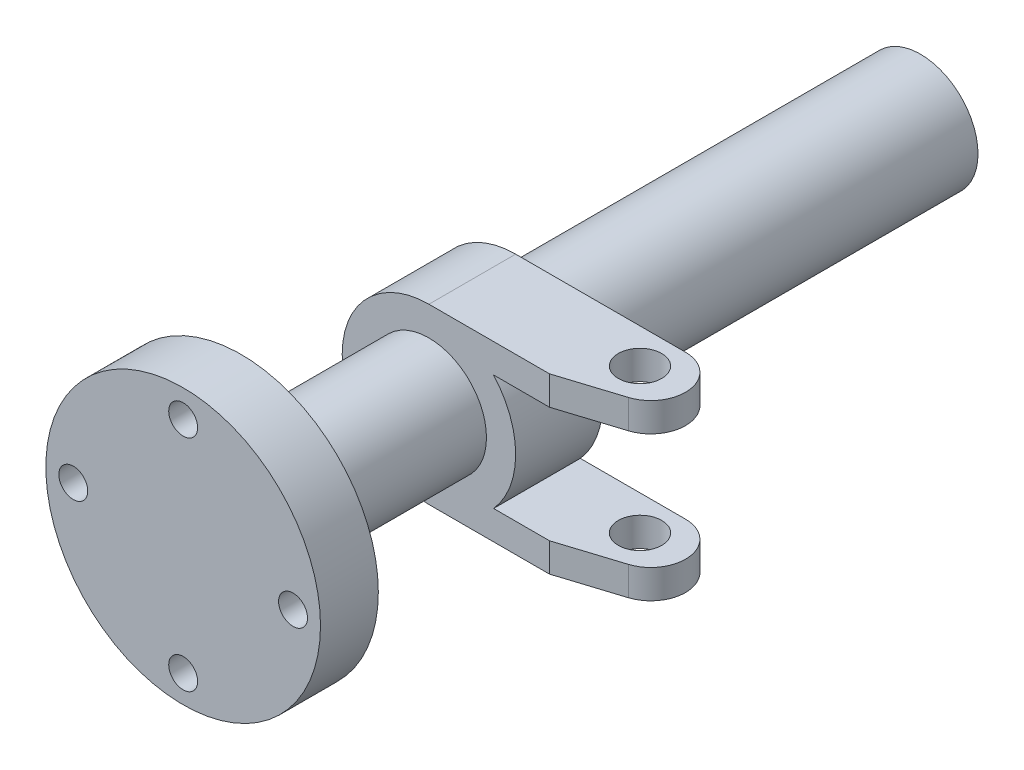
ISO-10303-21;
HEADER;
FILE_DESCRIPTION(('STEP AP214'),'2;1');
FILE_NAME('part.step','',(''),(''),'','','');
FILE_SCHEMA(('AUTOMOTIVE_DESIGN { 1 0 10303 214 1 1 1 1 }'));
ENDSEC;
DATA;
#1=APPLICATION_CONTEXT('core data for automotive mechanical design processes');
#2=APPLICATION_PROTOCOL_DEFINITION('international standard','automotive_design',2000,#1);
#3=PRODUCT_CONTEXT('',#1,'mechanical');
#4=PRODUCT('Part','Part','',(#3));
#5=PRODUCT_RELATED_PRODUCT_CATEGORY('part','',(#4));
#6=PRODUCT_DEFINITION_FORMATION('','',#4);
#7=PRODUCT_DEFINITION_CONTEXT('part definition',#1,'design');
#8=PRODUCT_DEFINITION('design','',#6,#7);
#9=PRODUCT_DEFINITION_SHAPE('','',#8);
#10=(LENGTH_UNIT() NAMED_UNIT(*) SI_UNIT(.MILLI.,.METRE.));
#11=(NAMED_UNIT(*) PLANE_ANGLE_UNIT() SI_UNIT($,.RADIAN.));
#12=(NAMED_UNIT(*) SI_UNIT($,.STERADIAN.) SOLID_ANGLE_UNIT());
#13=UNCERTAINTY_MEASURE_WITH_UNIT(LENGTH_MEASURE(1.E-05),#10,'distance_accuracy_value','');
#14=(GEOMETRIC_REPRESENTATION_CONTEXT(3) GLOBAL_UNCERTAINTY_ASSIGNED_CONTEXT((#13)) GLOBAL_UNIT_ASSIGNED_CONTEXT((#10,
#11,#12)) REPRESENTATION_CONTEXT('',''));
#15=CARTESIAN_POINT('',(0.,0.,0.));
#16=DIRECTION('',(0.,0.,1.));
#17=DIRECTION('',(1.,0.,0.));
#18=AXIS2_PLACEMENT_3D('',#15,#16,#17);
#19=CARTESIAN_POINT('',(0.,0.,0.));
#20=DIRECTION('',(0.,0.,1.));
#21=DIRECTION('',(1.,0.,0.));
#22=AXIS2_PLACEMENT_3D('',#19,#20,#21);
#23=CYLINDRICAL_SURFACE('',#22,30.);
#24=CARTESIAN_POINT('',(0.,0.,-85.));
#25=DIRECTION('',(0.,0.,1.));
#26=DIRECTION('',(1.,0.,0.));
#27=AXIS2_PLACEMENT_3D('',#24,#25,#26);
#28=CIRCLE('',#27,30.);
#29=CARTESIAN_POINT('',(22.3606797749979,-20.,-85.));
#30=VERTEX_POINT('',#29);
#31=CARTESIAN_POINT('',(22.3606797749979,20.,-85.));
#32=VERTEX_POINT('',#31);
#33=EDGE_CURVE('E69',#30,#32,#28,.T.);
#34=ORIENTED_EDGE('',*,*,#33,.F.);
#35=DIRECTION('',(0.,0.,1.));
#36=VECTOR('',#35,1.);
#37=CARTESIAN_POINT('',(22.3606797749979,-20.,0.));
#38=LINE('',#37,#36);
#39=CARTESIAN_POINT('',(22.3606797749979,-20.,-115.));
#40=VERTEX_POINT('',#39);
#41=EDGE_CURVE('E182',#30,#40,#38,.F.);
#42=ORIENTED_EDGE('',*,*,#41,.T.);
#43=CARTESIAN_POINT('',(0.,0.,-115.));
#44=DIRECTION('',(0.,0.,1.));
#45=DIRECTION('',(1.,0.,0.));
#46=AXIS2_PLACEMENT_3D('',#43,#44,#45);
#47=CIRCLE('',#46,30.);
#48=CARTESIAN_POINT('',(22.3606797749979,20.,-115.));
#49=VERTEX_POINT('',#48);
#50=EDGE_CURVE('E152',#40,#49,#47,.T.);
#51=ORIENTED_EDGE('',*,*,#50,.T.);
#52=DIRECTION('',(0.,0.,1.));
#53=VECTOR('',#52,1.);
#54=CARTESIAN_POINT('',(22.3606797749979,20.,0.));
#55=LINE('',#54,#53);
#56=EDGE_CURVE('E231',#49,#32,#55,.T.);
#57=ORIENTED_EDGE('',*,*,#56,.T.);
#58=EDGE_LOOP('',(#34,#42,#51,#57));
#59=FACE_BOUND('',#58,.T.);
#60=ADVANCED_FACE('F45',(#59),#23,.T.);
#61=CARTESIAN_POINT('',(0.,30.,-115.));
#62=VERTEX_POINT('',#61);
#63=CARTESIAN_POINT('',(0.,-30.,-115.));
#64=VERTEX_POINT('',#63);
#65=EDGE_CURVE('E61',#62,#64,#47,.T.);
#66=ORIENTED_EDGE('',*,*,#65,.T.);
#67=DIRECTION('',(0.,0.,1.));
#68=VECTOR('',#67,1.);
#69=CARTESIAN_POINT('',(0.,-30.,-115.));
#70=LINE('',#69,#68);
#71=CARTESIAN_POINT('',(0.,-30.,-85.));
#72=VERTEX_POINT('',#71);
#73=EDGE_CURVE('E167',#64,#72,#70,.T.);
#74=ORIENTED_EDGE('',*,*,#73,.T.);
#75=CARTESIAN_POINT('',(0.,30.,-85.));
#76=VERTEX_POINT('',#75);
#77=EDGE_CURVE('E256',#76,#72,#28,.T.);
#78=ORIENTED_EDGE('',*,*,#77,.F.);
#79=DIRECTION('',(0.,0.,1.));
#80=VECTOR('',#79,1.);
#81=CARTESIAN_POINT('',(0.,30.,-115.));
#82=LINE('',#81,#80);
#83=EDGE_CURVE('E192',#62,#76,#82,.T.);
#84=ORIENTED_EDGE('',*,*,#83,.F.);
#85=EDGE_LOOP('',(#66,#74,#78,#84));
#86=FACE_BOUND('',#85,.T.);
#87=ADVANCED_FACE('F275',(#86),#23,.T.);
#88=CARTESIAN_POINT('',(0.,0.,-255.));
#89=DIRECTION('',(0.,0.,-1.));
#90=DIRECTION('',(-1.,0.,0.));
#91=AXIS2_PLACEMENT_3D('',#88,#89,#90);
#92=PLANE('',#91);
#93=CARTESIAN_POINT('',(0.,0.,-255.));
#94=DIRECTION('',(0.,0.,1.));
#95=DIRECTION('',(1.,0.,0.));
#96=AXIS2_PLACEMENT_3D('',#93,#94,#95);
#97=CIRCLE('',#96,19.9);
#98=CARTESIAN_POINT('',(19.9,0.,-255.));
#99=VERTEX_POINT('',#98);
#100=EDGE_CURVE('E11',#99,#99,#97,.T.);
#101=ORIENTED_EDGE('',*,*,#100,.F.);
#102=EDGE_LOOP('',(#101));
#103=FACE_BOUND('',#102,.T.);
#104=ADVANCED_FACE('F47',(#103),#92,.T.);
#105=CARTESIAN_POINT('',(0.,0.,0.));
#106=DIRECTION('',(0.,0.,1.));
#107=DIRECTION('',(1.,0.,0.));
#108=AXIS2_PLACEMENT_3D('',#105,#106,#107);
#109=CYLINDRICAL_SURFACE('',#108,19.9);
#110=ORIENTED_EDGE('',*,*,#100,.T.);
#111=EDGE_LOOP('',(#110));
#112=FACE_BOUND('',#111,.T.);
#113=CARTESIAN_POINT('',(0.,0.,-115.));
#114=DIRECTION('',(0.,0.,1.));
#115=DIRECTION('',(1.,0.,0.));
#116=AXIS2_PLACEMENT_3D('',#113,#114,#115);
#117=CIRCLE('',#116,19.9);
#118=CARTESIAN_POINT('',(19.9,0.,-115.));
#119=VERTEX_POINT('',#118);
#120=EDGE_CURVE('E54',#119,#119,#117,.T.);
#121=ORIENTED_EDGE('',*,*,#120,.F.);
#122=EDGE_LOOP('',(#121));
#123=FACE_BOUND('',#122,.T.);
#124=ADVANCED_FACE('F265',(#112,#123),#109,.T.);
#125=CARTESIAN_POINT('',(19.9,0.,-115.));
#126=DIRECTION('',(0.,0.,-1.));
#127=DIRECTION('',(-1.,0.,0.));
#128=AXIS2_PLACEMENT_3D('',#125,#126,#127);
#129=PLANE('',#128);
#130=ORIENTED_EDGE('',*,*,#50,.F.);
#131=DIRECTION('',(-1.,0.,0.));
#132=VECTOR('',#131,1.);
#133=CARTESIAN_POINT('',(0.,-20.,-115.));
#134=LINE('',#133,#132);
#135=CARTESIAN_POINT('',(58.75,-20.,-115.));
#136=VERTEX_POINT('',#135);
#137=EDGE_CURVE('E130',#136,#40,#134,.T.);
#138=ORIENTED_EDGE('',*,*,#137,.F.);
#139=DIRECTION('',(0.,-1.,0.));
#140=VECTOR('',#139,1.);
#141=CARTESIAN_POINT('',(58.75,-20.,-115.));
#142=LINE('',#141,#140);
#143=CARTESIAN_POINT('',(58.75,-30.,-115.));
#144=VERTEX_POINT('',#143);
#145=EDGE_CURVE('E139',#136,#144,#142,.T.);
#146=ORIENTED_EDGE('',*,*,#145,.T.);
#147=DIRECTION('',(-1.,0.,0.));
#148=VECTOR('',#147,1.);
#149=CARTESIAN_POINT('',(0.,-30.,-115.));
#150=LINE('',#149,#148);
#151=EDGE_CURVE('E170',#144,#64,#150,.T.);
#152=ORIENTED_EDGE('',*,*,#151,.T.);
#153=ORIENTED_EDGE('',*,*,#65,.F.);
#154=DIRECTION('',(-1.,0.,0.));
#155=VECTOR('',#154,1.);
#156=CARTESIAN_POINT('',(0.,30.,-115.));
#157=LINE('',#156,#155);
#158=CARTESIAN_POINT('',(58.75,30.,-115.));
#159=VERTEX_POINT('',#158);
#160=EDGE_CURVE('E200',#159,#62,#157,.T.);
#161=ORIENTED_EDGE('',*,*,#160,.F.);
#162=DIRECTION('',(0.,1.,0.));
#163=VECTOR('',#162,1.);
#164=CARTESIAN_POINT('',(58.75,20.,-115.));
#165=LINE('',#164,#163);
#166=CARTESIAN_POINT('',(58.75,20.,-115.));
#167=VERTEX_POINT('',#166);
#168=EDGE_CURVE('E228',#167,#159,#165,.T.);
#169=ORIENTED_EDGE('',*,*,#168,.F.);
#170=DIRECTION('',(-1.,0.,0.));
#171=VECTOR('',#170,1.);
#172=CARTESIAN_POINT('',(0.,20.,-115.));
#173=LINE('',#172,#171);
#174=EDGE_CURVE('E207',#167,#49,#173,.T.);
#175=ORIENTED_EDGE('',*,*,#174,.T.);
#176=EDGE_LOOP('',(#130,#138,#146,#152,#153,#161,#169,#175));
#177=FACE_BOUND('',#176,.T.);
#178=ORIENTED_EDGE('',*,*,#120,.T.);
#179=EDGE_LOOP('',(#178));
#180=FACE_BOUND('',#179,.T.);
#181=ADVANCED_FACE('F149',(#177,#180),#129,.T.);
#182=CARTESIAN_POINT('',(30.,0.,-85.));
#183=DIRECTION('',(0.,0.,1.));
#184=DIRECTION('',(1.,0.,0.));
#185=AXIS2_PLACEMENT_3D('',#182,#183,#184);
#186=PLANE('',#185);
#187=ORIENTED_EDGE('',*,*,#77,.T.);
#188=DIRECTION('',(1.,0.,0.));
#189=VECTOR('',#188,1.);
#190=CARTESIAN_POINT('',(0.,-30.,-85.));
#191=LINE('',#190,#189);
#192=CARTESIAN_POINT('',(41.6842080505747,-30.,-85.));
#193=VERTEX_POINT('',#192);
#194=EDGE_CURVE('E154',#72,#193,#191,.T.);
#195=ORIENTED_EDGE('',*,*,#194,.T.);
#196=DIRECTION('',(0.,-1.,0.));
#197=VECTOR('',#196,1.);
#198=CARTESIAN_POINT('',(41.6842080505747,-20.,-85.));
#199=LINE('',#198,#197);
#200=CARTESIAN_POINT('',(41.6842080505747,-20.,-85.));
#201=VERTEX_POINT('',#200);
#202=EDGE_CURVE('E178',#201,#193,#199,.T.);
#203=ORIENTED_EDGE('',*,*,#202,.F.);
#204=DIRECTION('',(1.,0.,0.));
#205=VECTOR('',#204,1.);
#206=CARTESIAN_POINT('',(41.6842080505747,-20.,-85.));
#207=LINE('',#206,#205);
#208=EDGE_CURVE('E147',#30,#201,#207,.T.);
#209=ORIENTED_EDGE('',*,*,#208,.F.);
#210=ORIENTED_EDGE('',*,*,#33,.T.);
#211=DIRECTION('',(1.,0.,0.));
#212=VECTOR('',#211,1.);
#213=CARTESIAN_POINT('',(0.,20.,-85.));
#214=LINE('',#213,#212);
#215=CARTESIAN_POINT('',(41.6842080505747,20.,-85.));
#216=VERTEX_POINT('',#215);
#217=EDGE_CURVE('E196',#32,#216,#214,.T.);
#218=ORIENTED_EDGE('',*,*,#217,.T.);
#219=DIRECTION('',(0.,1.,0.));
#220=VECTOR('',#219,1.);
#221=CARTESIAN_POINT('',(41.6842080505747,20.,-85.));
#222=LINE('',#221,#220);
#223=CARTESIAN_POINT('',(41.6842080505747,30.,-85.));
#224=VERTEX_POINT('',#223);
#225=EDGE_CURVE('E210',#216,#224,#222,.T.);
#226=ORIENTED_EDGE('',*,*,#225,.T.);
#227=DIRECTION('',(1.,0.,0.));
#228=VECTOR('',#227,1.);
#229=CARTESIAN_POINT('',(41.6842080505747,30.,-85.));
#230=LINE('',#229,#228);
#231=EDGE_CURVE('E214',#76,#224,#230,.T.);
#232=ORIENTED_EDGE('',*,*,#231,.F.);
#233=EDGE_LOOP('',(#187,#195,#203,#209,#210,#218,#226,#232));
#234=FACE_BOUND('',#233,.T.);
#235=CARTESIAN_POINT('',(0.,0.,-85.));
#236=DIRECTION('',(0.,0.,1.));
#237=DIRECTION('',(1.,0.,0.));
#238=AXIS2_PLACEMENT_3D('',#235,#236,#237);
#239=CIRCLE('',#238,19.9);
#240=CARTESIAN_POINT('',(19.9,0.,-85.));
#241=VERTEX_POINT('',#240);
#242=EDGE_CURVE('E252',#241,#241,#239,.T.);
#243=ORIENTED_EDGE('',*,*,#242,.F.);
#244=EDGE_LOOP('',(#243));
#245=FACE_BOUND('',#244,.T.);
#246=ADVANCED_FACE('F273',(#234,#245),#186,.T.);
#247=CARTESIAN_POINT('',(0.,0.,0.));
#248=DIRECTION('',(0.,0.,1.));
#249=DIRECTION('',(1.,0.,0.));
#250=AXIS2_PLACEMENT_3D('',#247,#248,#249);
#251=CYLINDRICAL_SURFACE('',#250,19.9);
#252=ORIENTED_EDGE('',*,*,#242,.T.);
#253=EDGE_LOOP('',(#252));
#254=FACE_BOUND('',#253,.T.);
#255=CARTESIAN_POINT('',(0.,0.,-20.));
#256=DIRECTION('',(0.,0.,1.));
#257=DIRECTION('',(1.,0.,0.));
#258=AXIS2_PLACEMENT_3D('',#255,#256,#257);
#259=CIRCLE('',#258,19.9);
#260=CARTESIAN_POINT('',(19.9,0.,-20.));
#261=VERTEX_POINT('',#260);
#262=EDGE_CURVE('E248',#261,#261,#259,.T.);
#263=ORIENTED_EDGE('',*,*,#262,.F.);
#264=EDGE_LOOP('',(#263));
#265=FACE_BOUND('',#264,.T.);
#266=ADVANCED_FACE('F286',(#254,#265),#251,.T.);
#267=CARTESIAN_POINT('',(19.9,0.,-20.));
#268=DIRECTION('',(0.,0.,-1.));
#269=DIRECTION('',(-1.,0.,0.));
#270=AXIS2_PLACEMENT_3D('',#267,#268,#269);
#271=PLANE('',#270);
#272=CARTESIAN_POINT('',(38.,3.98028872628117E-13,-20.));
#273=DIRECTION('',(0.,0.,-1.));
#274=DIRECTION('',(-1.,0.,0.));
#275=AXIS2_PLACEMENT_3D('',#272,#273,#274);
#276=CIRCLE('',#275,7.);
#277=CARTESIAN_POINT('',(31.,3.98028872628117E-13,-20.));
#278=VERTEX_POINT('',#277);
#279=EDGE_CURVE('E392',#278,#278,#276,.T.);
#280=ORIENTED_EDGE('',*,*,#279,.F.);
#281=EDGE_LOOP('',(#280));
#282=FACE_BOUND('',#281,.T.);
#283=CARTESIAN_POINT('',(0.,-38.,-20.));
#284=DIRECTION('',(0.,0.,-1.));
#285=DIRECTION('',(-1.,0.,0.));
#286=AXIS2_PLACEMENT_3D('',#283,#284,#285);
#287=CIRCLE('',#286,7.);
#288=CARTESIAN_POINT('',(-7.,-38.,-20.));
#289=VERTEX_POINT('',#288);
#290=EDGE_CURVE('E406',#289,#289,#287,.T.);
#291=ORIENTED_EDGE('',*,*,#290,.F.);
#292=EDGE_LOOP('',(#291));
#293=FACE_BOUND('',#292,.T.);
#294=CARTESIAN_POINT('',(-38.,-1.32676290876039E-13,-20.));
#295=DIRECTION('',(0.,0.,-1.));
#296=DIRECTION('',(-1.,0.,0.));
#297=AXIS2_PLACEMENT_3D('',#294,#295,#296);
#298=CIRCLE('',#297,7.);
#299=CARTESIAN_POINT('',(-45.,-1.32676290876039E-13,-20.));
#300=VERTEX_POINT('',#299);
#301=EDGE_CURVE('E422',#300,#300,#298,.T.);
#302=ORIENTED_EDGE('',*,*,#301,.F.);
#303=EDGE_LOOP('',(#302));
#304=FACE_BOUND('',#303,.T.);
#305=CARTESIAN_POINT('',(0.,38.,-20.));
#306=DIRECTION('',(0.,0.,-1.));
#307=DIRECTION('',(-1.,0.,0.));
#308=AXIS2_PLACEMENT_3D('',#305,#306,#307);
#309=CIRCLE('',#308,7.);
#310=CARTESIAN_POINT('',(-7.,38.,-20.));
#311=VERTEX_POINT('',#310);
#312=EDGE_CURVE('E438',#311,#311,#309,.T.);
#313=ORIENTED_EDGE('',*,*,#312,.F.);
#314=EDGE_LOOP('',(#313));
#315=FACE_BOUND('',#314,.T.);
#316=ORIENTED_EDGE('',*,*,#262,.T.);
#317=EDGE_LOOP('',(#316));
#318=FACE_BOUND('',#317,.T.);
#319=CARTESIAN_POINT('',(0.,0.,-20.));
#320=DIRECTION('',(0.,0.,1.));
#321=DIRECTION('',(1.,0.,0.));
#322=AXIS2_PLACEMENT_3D('',#319,#320,#321);
#323=CIRCLE('',#322,47.5);
#324=CARTESIAN_POINT('',(47.5,0.,-20.));
#325=VERTEX_POINT('',#324);
#326=EDGE_CURVE('E244',#325,#325,#323,.T.);
#327=ORIENTED_EDGE('',*,*,#326,.F.);
#328=EDGE_LOOP('',(#327));
#329=FACE_BOUND('',#328,.T.);
#330=ADVANCED_FACE('F289',(#282,#293,#304,#315,#318,#329),#271,.T.);
#331=CARTESIAN_POINT('',(0.,0.,0.));
#332=DIRECTION('',(0.,0.,1.));
#333=DIRECTION('',(1.,0.,0.));
#334=AXIS2_PLACEMENT_3D('',#331,#332,#333);
#335=CYLINDRICAL_SURFACE('',#334,47.5);
#336=ORIENTED_EDGE('',*,*,#326,.T.);
#337=EDGE_LOOP('',(#336));
#338=FACE_BOUND('',#337,.T.);
#339=CARTESIAN_POINT('',(0.,0.,0.));
#340=DIRECTION('',(0.,0.,1.));
#341=DIRECTION('',(1.,0.,0.));
#342=AXIS2_PLACEMENT_3D('',#339,#340,#341);
#343=CIRCLE('',#342,47.5);
#344=CARTESIAN_POINT('',(47.5,0.,0.));
#345=VERTEX_POINT('',#344);
#346=EDGE_CURVE('E240',#345,#345,#343,.T.);
#347=ORIENTED_EDGE('',*,*,#346,.F.);
#348=EDGE_LOOP('',(#347));
#349=FACE_BOUND('',#348,.T.);
#350=ADVANCED_FACE('F293',(#338,#349),#335,.T.);
#351=CARTESIAN_POINT('',(47.5,0.,0.));
#352=DIRECTION('',(0.,0.,1.));
#353=DIRECTION('',(1.,0.,0.));
#354=AXIS2_PLACEMENT_3D('',#351,#352,#353);
#355=PLANE('',#354);
#356=CARTESIAN_POINT('',(38.,3.98028872628117E-13,0.));
#357=DIRECTION('',(0.,0.,-1.));
#358=DIRECTION('',(-1.,0.,0.));
#359=AXIS2_PLACEMENT_3D('',#356,#357,#358);
#360=CIRCLE('',#359,5.);
#361=CARTESIAN_POINT('',(33.,3.98028872628117E-13,0.));
#362=VERTEX_POINT('',#361);
#363=EDGE_CURVE('E402',#362,#362,#360,.T.);
#364=ORIENTED_EDGE('',*,*,#363,.T.);
#365=EDGE_LOOP('',(#364));
#366=FACE_BOUND('',#365,.T.);
#367=CARTESIAN_POINT('',(0.,-38.,0.));
#368=DIRECTION('',(0.,0.,-1.));
#369=DIRECTION('',(-1.,0.,0.));
#370=AXIS2_PLACEMENT_3D('',#367,#368,#369);
#371=CIRCLE('',#370,5.);
#372=CARTESIAN_POINT('',(-5.,-38.,0.));
#373=VERTEX_POINT('',#372);
#374=EDGE_CURVE('E418',#373,#373,#371,.T.);
#375=ORIENTED_EDGE('',*,*,#374,.T.);
#376=EDGE_LOOP('',(#375));
#377=FACE_BOUND('',#376,.T.);
#378=CARTESIAN_POINT('',(-38.,-1.32676290876039E-13,0.));
#379=DIRECTION('',(0.,0.,-1.));
#380=DIRECTION('',(-1.,0.,0.));
#381=AXIS2_PLACEMENT_3D('',#378,#379,#380);
#382=CIRCLE('',#381,5.);
#383=CARTESIAN_POINT('',(-43.,-1.32676290876039E-13,0.));
#384=VERTEX_POINT('',#383);
#385=EDGE_CURVE('E434',#384,#384,#382,.T.);
#386=ORIENTED_EDGE('',*,*,#385,.T.);
#387=EDGE_LOOP('',(#386));
#388=FACE_BOUND('',#387,.T.);
#389=CARTESIAN_POINT('',(0.,38.,0.));
#390=DIRECTION('',(0.,0.,-1.));
#391=DIRECTION('',(-1.,0.,0.));
#392=AXIS2_PLACEMENT_3D('',#389,#390,#391);
#393=CIRCLE('',#392,5.);
#394=CARTESIAN_POINT('',(-5.,38.,0.));
#395=VERTEX_POINT('',#394);
#396=EDGE_CURVE('E450',#395,#395,#393,.T.);
#397=ORIENTED_EDGE('',*,*,#396,.T.);
#398=EDGE_LOOP('',(#397));
#399=FACE_BOUND('',#398,.T.);
#400=ORIENTED_EDGE('',*,*,#346,.T.);
#401=EDGE_LOOP('',(#400));
#402=FACE_BOUND('',#401,.T.);
#403=ADVANCED_FACE('F297',(#366,#377,#388,#399,#402),#355,.T.);
#404=CARTESIAN_POINT('',(58.75,20.,-103.));
#405=DIRECTION('',(0.,1.,0.));
#406=DIRECTION('',(0.,0.,1.));
#407=AXIS2_PLACEMENT_3D('',#404,#405,#406);
#408=CYLINDRICAL_SURFACE('',#407,12.);
#409=CARTESIAN_POINT('',(58.75,30.,-103.));
#410=DIRECTION('',(0.,1.,0.));
#411=DIRECTION('',(0.,0.,1.));
#412=AXIS2_PLACEMENT_3D('',#409,#410,#411);
#413=CIRCLE('',#412,12.);
#414=CARTESIAN_POINT('',(62.3769898948419,30.,-91.5612525028867));
#415=VERTEX_POINT('',#414);
#416=EDGE_CURVE('E222',#415,#159,#413,.T.);
#417=ORIENTED_EDGE('',*,*,#416,.F.);
#418=DIRECTION('',(0.,1.,0.));
#419=VECTOR('',#418,1.);
#420=CARTESIAN_POINT('',(62.3769898948419,20.,-91.5612525028867));
#421=LINE('',#420,#419);
#422=CARTESIAN_POINT('',(62.3769898948419,20.,-91.5612525028867));
#423=VERTEX_POINT('',#422);
#424=EDGE_CURVE('E232',#423,#415,#421,.T.);
#425=ORIENTED_EDGE('',*,*,#424,.F.);
#426=CARTESIAN_POINT('',(58.75,20.,-103.));
#427=DIRECTION('',(0.,1.,0.));
#428=DIRECTION('',(0.,0.,1.));
#429=AXIS2_PLACEMENT_3D('',#426,#427,#428);
#430=CIRCLE('',#429,12.);
#431=EDGE_CURVE('E203',#423,#167,#430,.T.);
#432=ORIENTED_EDGE('',*,*,#431,.T.);
#433=ORIENTED_EDGE('',*,*,#168,.T.);
#434=EDGE_LOOP('',(#417,#425,#432,#433));
#435=FACE_BOUND('',#434,.T.);
#436=ADVANCED_FACE('F301',(#435),#408,.T.);
#437=CARTESIAN_POINT('',(60.,20.,-90.8075582430118));
#438=DIRECTION('',(0.302249157903488,0.,0.953228958092772));
#439=DIRECTION('',(0.953228958092772,0.,-0.302249157903488));
#440=AXIS2_PLACEMENT_3D('',#437,#438,#439);
#441=PLANE('',#440);
#442=DIRECTION('',(0.953228958092772,0.,-0.302249157903488));
#443=VECTOR('',#442,1.);
#444=CARTESIAN_POINT('',(60.,30.,-90.8075582430118));
#445=LINE('',#444,#443);
#446=EDGE_CURVE('E218',#224,#415,#445,.T.);
#447=ORIENTED_EDGE('',*,*,#446,.F.);
#448=ORIENTED_EDGE('',*,*,#225,.F.);
#449=DIRECTION('',(0.953228958092773,0.,-0.302249157903487));
#450=VECTOR('',#449,1.);
#451=CARTESIAN_POINT('',(60.,20.,-90.8075582430118));
#452=LINE('',#451,#450);
#453=EDGE_CURVE('E199',#216,#423,#452,.T.);
#454=ORIENTED_EDGE('',*,*,#453,.T.);
#455=ORIENTED_EDGE('',*,*,#424,.T.);
#456=EDGE_LOOP('',(#447,#448,#454,#455));
#457=FACE_BOUND('',#456,.T.);
#458=ADVANCED_FACE('F303',(#457),#441,.T.);
#459=CARTESIAN_POINT('',(58.75,20.,-103.));
#460=DIRECTION('',(0.,1.,0.));
#461=DIRECTION('',(0.,0.,1.));
#462=AXIS2_PLACEMENT_3D('',#459,#460,#461);
#463=PLANE('',#462);
#464=ORIENTED_EDGE('',*,*,#56,.F.);
#465=ORIENTED_EDGE('',*,*,#174,.F.);
#466=ORIENTED_EDGE('',*,*,#431,.F.);
#467=ORIENTED_EDGE('',*,*,#453,.F.);
#468=ORIENTED_EDGE('',*,*,#217,.F.);
#469=EDGE_LOOP('',(#464,#465,#466,#467,#468));
#470=FACE_BOUND('',#469,.T.);
#471=CARTESIAN_POINT('',(55.,20.,-103.));
#472=DIRECTION('',(0.,1.,0.));
#473=DIRECTION('',(0.,0.,1.));
#474=AXIS2_PLACEMENT_3D('',#471,#472,#473);
#475=CIRCLE('',#474,7.5);
#476=CARTESIAN_POINT('',(55.,20.,-95.5));
#477=VERTEX_POINT('',#476);
#478=EDGE_CURVE('E188',#477,#477,#475,.T.);
#479=ORIENTED_EDGE('',*,*,#478,.T.);
#480=EDGE_LOOP('',(#479));
#481=FACE_BOUND('',#480,.T.);
#482=ADVANCED_FACE('F306',(#470,#481),#463,.F.);
#483=CARTESIAN_POINT('',(58.75,30.,-103.));
#484=DIRECTION('',(0.,1.,0.));
#485=DIRECTION('',(0.,0.,1.));
#486=AXIS2_PLACEMENT_3D('',#483,#484,#485);
#487=PLANE('',#486);
#488=CARTESIAN_POINT('',(55.,30.,-103.));
#489=DIRECTION('',(0.,1.,0.));
#490=DIRECTION('',(0.,0.,1.));
#491=AXIS2_PLACEMENT_3D('',#488,#489,#490);
#492=CIRCLE('',#491,7.5);
#493=CARTESIAN_POINT('',(55.,30.,-95.5));
#494=VERTEX_POINT('',#493);
#495=EDGE_CURVE('E187',#494,#494,#492,.T.);
#496=ORIENTED_EDGE('',*,*,#495,.F.);
#497=EDGE_LOOP('',(#496));
#498=FACE_BOUND('',#497,.T.);
#499=ORIENTED_EDGE('',*,*,#83,.T.);
#500=ORIENTED_EDGE('',*,*,#231,.T.);
#501=ORIENTED_EDGE('',*,*,#446,.T.);
#502=ORIENTED_EDGE('',*,*,#416,.T.);
#503=ORIENTED_EDGE('',*,*,#160,.T.);
#504=EDGE_LOOP('',(#499,#500,#501,#502,#503));
#505=FACE_BOUND('',#504,.T.);
#506=ADVANCED_FACE('F311',(#498,#505),#487,.T.);
#507=CARTESIAN_POINT('',(55.,20.,-103.));
#508=DIRECTION('',(0.,1.,0.));
#509=DIRECTION('',(0.,0.,1.));
#510=AXIS2_PLACEMENT_3D('',#507,#508,#509);
#511=CYLINDRICAL_SURFACE('',#510,7.5);
#512=ORIENTED_EDGE('',*,*,#478,.F.);
#513=EDGE_LOOP('',(#512));
#514=FACE_BOUND('',#513,.T.);
#515=ORIENTED_EDGE('',*,*,#495,.T.);
#516=EDGE_LOOP('',(#515));
#517=FACE_BOUND('',#516,.T.);
#518=ADVANCED_FACE('F314',(#514,#517),#511,.F.);
#519=CARTESIAN_POINT('',(58.75,-20.,-103.));
#520=DIRECTION('',(0.,-1.,0.));
#521=DIRECTION('',(0.,0.,1.));
#522=AXIS2_PLACEMENT_3D('',#519,#520,#521);
#523=PLANE('',#522);
#524=ORIENTED_EDGE('',*,*,#41,.F.);
#525=ORIENTED_EDGE('',*,*,#208,.T.);
#526=DIRECTION('',(0.953228958092772,0.,-0.302249157903488));
#527=VECTOR('',#526,1.);
#528=CARTESIAN_POINT('',(60.,-20.,-90.8075582430118));
#529=LINE('',#528,#527);
#530=CARTESIAN_POINT('',(62.3769898948419,-20.,-91.5612525028867));
#531=VERTEX_POINT('',#530);
#532=EDGE_CURVE('E132',#201,#531,#529,.T.);
#533=ORIENTED_EDGE('',*,*,#532,.T.);
#534=CARTESIAN_POINT('',(58.75,-20.,-103.));
#535=DIRECTION('',(0.,1.,0.));
#536=DIRECTION('',(0.,0.,1.));
#537=AXIS2_PLACEMENT_3D('',#534,#535,#536);
#538=CIRCLE('',#537,12.);
#539=EDGE_CURVE('E125',#531,#136,#538,.T.);
#540=ORIENTED_EDGE('',*,*,#539,.T.);
#541=ORIENTED_EDGE('',*,*,#137,.T.);
#542=EDGE_LOOP('',(#524,#525,#533,#540,#541));
#543=FACE_BOUND('',#542,.T.);
#544=CARTESIAN_POINT('',(55.,-20.,-103.));
#545=DIRECTION('',(0.,1.,0.));
#546=DIRECTION('',(0.,0.,1.));
#547=AXIS2_PLACEMENT_3D('',#544,#545,#546);
#548=CIRCLE('',#547,7.5);
#549=CARTESIAN_POINT('',(55.,-20.,-95.5));
#550=VERTEX_POINT('',#549);
#551=EDGE_CURVE('E171',#550,#550,#548,.T.);
#552=ORIENTED_EDGE('',*,*,#551,.F.);
#553=EDGE_LOOP('',(#552));
#554=FACE_BOUND('',#553,.T.);
#555=ADVANCED_FACE('F127',(#543,#554),#523,.F.);
#556=CARTESIAN_POINT('',(58.75,-30.,-103.));
#557=DIRECTION('',(0.,-1.,0.));
#558=DIRECTION('',(0.,0.,1.));
#559=AXIS2_PLACEMENT_3D('',#556,#557,#558);
#560=PLANE('',#559);
#561=ORIENTED_EDGE('',*,*,#73,.F.);
#562=ORIENTED_EDGE('',*,*,#151,.F.);
#563=CARTESIAN_POINT('',(58.75,-30.,-103.));
#564=DIRECTION('',(0.,1.,0.));
#565=DIRECTION('',(0.,0.,1.));
#566=AXIS2_PLACEMENT_3D('',#563,#564,#565);
#567=CIRCLE('',#566,12.);
#568=CARTESIAN_POINT('',(62.3769898948419,-30.,-91.5612525028867));
#569=VERTEX_POINT('',#568);
#570=EDGE_CURVE('E142',#569,#144,#567,.T.);
#571=ORIENTED_EDGE('',*,*,#570,.F.);
#572=DIRECTION('',(0.953228958092773,0.,-0.302249157903487));
#573=VECTOR('',#572,1.);
#574=CARTESIAN_POINT('',(60.,-30.,-90.8075582430118));
#575=LINE('',#574,#573);
#576=EDGE_CURVE('E157',#193,#569,#575,.T.);
#577=ORIENTED_EDGE('',*,*,#576,.F.);
#578=ORIENTED_EDGE('',*,*,#194,.F.);
#579=EDGE_LOOP('',(#561,#562,#571,#577,#578));
#580=FACE_BOUND('',#579,.T.);
#581=CARTESIAN_POINT('',(55.,-30.,-103.));
#582=DIRECTION('',(0.,1.,0.));
#583=DIRECTION('',(0.,0.,1.));
#584=AXIS2_PLACEMENT_3D('',#581,#582,#583);
#585=CIRCLE('',#584,7.5);
#586=CARTESIAN_POINT('',(55.,-30.,-95.5));
#587=VERTEX_POINT('',#586);
#588=EDGE_CURVE('E160',#587,#587,#585,.T.);
#589=ORIENTED_EDGE('',*,*,#588,.T.);
#590=EDGE_LOOP('',(#589));
#591=FACE_BOUND('',#590,.T.);
#592=ADVANCED_FACE('F327',(#580,#591),#560,.T.);
#593=CARTESIAN_POINT('',(60.,-20.,-90.8075582430118));
#594=DIRECTION('',(-0.302249157903487,0.,-0.953228958092773));
#595=DIRECTION('',(-0.953228958092773,0.,0.302249157903487));
#596=AXIS2_PLACEMENT_3D('',#593,#594,#595);
#597=PLANE('',#596);
#598=ORIENTED_EDGE('',*,*,#576,.T.);
#599=DIRECTION('',(0.,-1.,0.));
#600=VECTOR('',#599,1.);
#601=CARTESIAN_POINT('',(62.3769898948419,-20.,-91.5612525028867));
#602=LINE('',#601,#600);
#603=EDGE_CURVE('E146',#531,#569,#602,.T.);
#604=ORIENTED_EDGE('',*,*,#603,.F.);
#605=ORIENTED_EDGE('',*,*,#532,.F.);
#606=ORIENTED_EDGE('',*,*,#202,.T.);
#607=EDGE_LOOP('',(#598,#604,#605,#606));
#608=FACE_BOUND('',#607,.T.);
#609=ADVANCED_FACE('F324',(#608),#597,.F.);
#610=CARTESIAN_POINT('',(58.75,-20.,-103.));
#611=DIRECTION('',(0.,-1.,0.));
#612=DIRECTION('',(0.,0.,-1.));
#613=AXIS2_PLACEMENT_3D('',#610,#611,#612);
#614=CYLINDRICAL_SURFACE('',#613,12.);
#615=ORIENTED_EDGE('',*,*,#570,.T.);
#616=ORIENTED_EDGE('',*,*,#145,.F.);
#617=ORIENTED_EDGE('',*,*,#539,.F.);
#618=ORIENTED_EDGE('',*,*,#603,.T.);
#619=EDGE_LOOP('',(#615,#616,#617,#618));
#620=FACE_BOUND('',#619,.T.);
#621=ADVANCED_FACE('F140',(#620),#614,.T.);
#622=CARTESIAN_POINT('',(55.,-20.,-103.));
#623=DIRECTION('',(0.,-1.,0.));
#624=DIRECTION('',(0.,0.,-1.));
#625=AXIS2_PLACEMENT_3D('',#622,#623,#624);
#626=CYLINDRICAL_SURFACE('',#625,7.5);
#627=ORIENTED_EDGE('',*,*,#551,.T.);
#628=EDGE_LOOP('',(#627));
#629=FACE_BOUND('',#628,.T.);
#630=ORIENTED_EDGE('',*,*,#588,.F.);
#631=EDGE_LOOP('',(#630));
#632=FACE_BOUND('',#631,.T.);
#633=ADVANCED_FACE('F323',(#629,#632),#626,.F.);
#634=CARTESIAN_POINT('',(0.,38.,-20.));
#635=DIRECTION('',(0.,0.,-1.));
#636=DIRECTION('',(-1.,0.,0.));
#637=AXIS2_PLACEMENT_3D('',#634,#635,#636);
#638=CYLINDRICAL_SURFACE('',#637,5.);
#639=ORIENTED_EDGE('',*,*,#396,.F.);
#640=EDGE_LOOP('',(#639));
#641=FACE_BOUND('',#640,.T.);
#642=CARTESIAN_POINT('',(0.,38.,-9.99999999999999));
#643=DIRECTION('',(0.,0.,-1.));
#644=DIRECTION('',(-1.,0.,0.));
#645=AXIS2_PLACEMENT_3D('',#642,#643,#644);
#646=CIRCLE('',#645,5.);
#647=CARTESIAN_POINT('',(-5.,38.,-9.99999999999999));
#648=VERTEX_POINT('',#647);
#649=EDGE_CURVE('E446',#648,#648,#646,.T.);
#650=ORIENTED_EDGE('',*,*,#649,.T.);
#651=EDGE_LOOP('',(#650));
#652=FACE_BOUND('',#651,.T.);
#653=ADVANCED_FACE('F336',(#641,#652),#638,.F.);
#654=CARTESIAN_POINT('',(5.,38.,-9.99999999999999));
#655=DIRECTION('',(0.,0.,1.));
#656=DIRECTION('',(1.,0.,0.));
#657=AXIS2_PLACEMENT_3D('',#654,#655,#656);
#658=PLANE('',#657);
#659=ORIENTED_EDGE('',*,*,#649,.F.);
#660=EDGE_LOOP('',(#659));
#661=FACE_BOUND('',#660,.T.);
#662=CARTESIAN_POINT('',(0.,38.,-9.99999999999999));
#663=DIRECTION('',(0.,0.,-1.));
#664=DIRECTION('',(-1.,0.,0.));
#665=AXIS2_PLACEMENT_3D('',#662,#663,#664);
#666=CIRCLE('',#665,7.);
#667=CARTESIAN_POINT('',(-7.,38.,-9.99999999999999));
#668=VERTEX_POINT('',#667);
#669=EDGE_CURVE('E442',#668,#668,#666,.T.);
#670=ORIENTED_EDGE('',*,*,#669,.T.);
#671=EDGE_LOOP('',(#670));
#672=FACE_BOUND('',#671,.T.);
#673=ADVANCED_FACE('F340',(#661,#672),#658,.F.);
#674=CARTESIAN_POINT('',(0.,38.,-20.));
#675=DIRECTION('',(0.,0.,-1.));
#676=DIRECTION('',(-1.,0.,0.));
#677=AXIS2_PLACEMENT_3D('',#674,#675,#676);
#678=CYLINDRICAL_SURFACE('',#677,7.);
#679=ORIENTED_EDGE('',*,*,#669,.F.);
#680=EDGE_LOOP('',(#679));
#681=FACE_BOUND('',#680,.T.);
#682=ORIENTED_EDGE('',*,*,#312,.T.);
#683=EDGE_LOOP('',(#682));
#684=FACE_BOUND('',#683,.T.);
#685=ADVANCED_FACE('F344',(#681,#684),#678,.F.);
#686=CARTESIAN_POINT('',(-38.,-1.32676290876039E-13,-20.));
#687=DIRECTION('',(0.,0.,-1.));
#688=DIRECTION('',(-1.,0.,0.));
#689=AXIS2_PLACEMENT_3D('',#686,#687,#688);
#690=CYLINDRICAL_SURFACE('',#689,5.);
#691=ORIENTED_EDGE('',*,*,#385,.F.);
#692=EDGE_LOOP('',(#691));
#693=FACE_BOUND('',#692,.T.);
#694=CARTESIAN_POINT('',(-38.,-1.32676290876039E-13,-9.99999999999999));
#695=DIRECTION('',(0.,0.,-1.));
#696=DIRECTION('',(-1.,0.,0.));
#697=AXIS2_PLACEMENT_3D('',#694,#695,#696);
#698=CIRCLE('',#697,5.);
#699=CARTESIAN_POINT('',(-43.,-1.32676290876039E-13,-9.99999999999999));
#700=VERTEX_POINT('',#699);
#701=EDGE_CURVE('E430',#700,#700,#698,.T.);
#702=ORIENTED_EDGE('',*,*,#701,.T.);
#703=EDGE_LOOP('',(#702));
#704=FACE_BOUND('',#703,.T.);
#705=ADVANCED_FACE('F348',(#693,#704),#690,.F.);
#706=CARTESIAN_POINT('',(-33.,-1.32676290876039E-13,-9.99999999999999));
#707=DIRECTION('',(0.,0.,1.));
#708=DIRECTION('',(1.,0.,0.));
#709=AXIS2_PLACEMENT_3D('',#706,#707,#708);
#710=PLANE('',#709);
#711=ORIENTED_EDGE('',*,*,#701,.F.);
#712=EDGE_LOOP('',(#711));
#713=FACE_BOUND('',#712,.T.);
#714=CARTESIAN_POINT('',(-38.,-1.32676290876039E-13,-9.99999999999999));
#715=DIRECTION('',(0.,0.,-1.));
#716=DIRECTION('',(-1.,0.,0.));
#717=AXIS2_PLACEMENT_3D('',#714,#715,#716);
#718=CIRCLE('',#717,7.);
#719=CARTESIAN_POINT('',(-45.,-1.32676290876039E-13,-9.99999999999999));
#720=VERTEX_POINT('',#719);
#721=EDGE_CURVE('E426',#720,#720,#718,.T.);
#722=ORIENTED_EDGE('',*,*,#721,.T.);
#723=EDGE_LOOP('',(#722));
#724=FACE_BOUND('',#723,.T.);
#725=ADVANCED_FACE('F352',(#713,#724),#710,.F.);
#726=CARTESIAN_POINT('',(-38.,-1.32676290876039E-13,-20.));
#727=DIRECTION('',(0.,0.,-1.));
#728=DIRECTION('',(-1.,0.,0.));
#729=AXIS2_PLACEMENT_3D('',#726,#727,#728);
#730=CYLINDRICAL_SURFACE('',#729,7.);
#731=ORIENTED_EDGE('',*,*,#721,.F.);
#732=EDGE_LOOP('',(#731));
#733=FACE_BOUND('',#732,.T.);
#734=ORIENTED_EDGE('',*,*,#301,.T.);
#735=EDGE_LOOP('',(#734));
#736=FACE_BOUND('',#735,.T.);
#737=ADVANCED_FACE('F356',(#733,#736),#730,.F.);
#738=CARTESIAN_POINT('',(0.,-38.,-20.));
#739=DIRECTION('',(0.,0.,-1.));
#740=DIRECTION('',(-1.,0.,0.));
#741=AXIS2_PLACEMENT_3D('',#738,#739,#740);
#742=CYLINDRICAL_SURFACE('',#741,5.);
#743=ORIENTED_EDGE('',*,*,#374,.F.);
#744=EDGE_LOOP('',(#743));
#745=FACE_BOUND('',#744,.T.);
#746=CARTESIAN_POINT('',(0.,-38.,-9.99999999999999));
#747=DIRECTION('',(0.,0.,-1.));
#748=DIRECTION('',(-1.,0.,0.));
#749=AXIS2_PLACEMENT_3D('',#746,#747,#748);
#750=CIRCLE('',#749,5.);
#751=CARTESIAN_POINT('',(-5.,-38.,-9.99999999999999));
#752=VERTEX_POINT('',#751);
#753=EDGE_CURVE('E414',#752,#752,#750,.T.);
#754=ORIENTED_EDGE('',*,*,#753,.T.);
#755=EDGE_LOOP('',(#754));
#756=FACE_BOUND('',#755,.T.);
#757=ADVANCED_FACE('F360',(#745,#756),#742,.F.);
#758=CARTESIAN_POINT('',(5.,-38.,-9.99999999999999));
#759=DIRECTION('',(0.,0.,1.));
#760=DIRECTION('',(1.,0.,0.));
#761=AXIS2_PLACEMENT_3D('',#758,#759,#760);
#762=PLANE('',#761);
#763=ORIENTED_EDGE('',*,*,#753,.F.);
#764=EDGE_LOOP('',(#763));
#765=FACE_BOUND('',#764,.T.);
#766=CARTESIAN_POINT('',(0.,-38.,-9.99999999999999));
#767=DIRECTION('',(0.,0.,-1.));
#768=DIRECTION('',(-1.,0.,0.));
#769=AXIS2_PLACEMENT_3D('',#766,#767,#768);
#770=CIRCLE('',#769,7.);
#771=CARTESIAN_POINT('',(-7.,-38.,-9.99999999999999));
#772=VERTEX_POINT('',#771);
#773=EDGE_CURVE('E410',#772,#772,#770,.T.);
#774=ORIENTED_EDGE('',*,*,#773,.T.);
#775=EDGE_LOOP('',(#774));
#776=FACE_BOUND('',#775,.T.);
#777=ADVANCED_FACE('F364',(#765,#776),#762,.F.);
#778=CARTESIAN_POINT('',(0.,-38.,-20.));
#779=DIRECTION('',(0.,0.,-1.));
#780=DIRECTION('',(-1.,0.,0.));
#781=AXIS2_PLACEMENT_3D('',#778,#779,#780);
#782=CYLINDRICAL_SURFACE('',#781,7.);
#783=ORIENTED_EDGE('',*,*,#773,.F.);
#784=EDGE_LOOP('',(#783));
#785=FACE_BOUND('',#784,.T.);
#786=ORIENTED_EDGE('',*,*,#290,.T.);
#787=EDGE_LOOP('',(#786));
#788=FACE_BOUND('',#787,.T.);
#789=ADVANCED_FACE('F368',(#785,#788),#782,.F.);
#790=CARTESIAN_POINT('',(38.,3.98028872628117E-13,-20.));
#791=DIRECTION('',(0.,0.,-1.));
#792=DIRECTION('',(-1.,0.,0.));
#793=AXIS2_PLACEMENT_3D('',#790,#791,#792);
#794=CYLINDRICAL_SURFACE('',#793,5.);
#795=ORIENTED_EDGE('',*,*,#363,.F.);
#796=EDGE_LOOP('',(#795));
#797=FACE_BOUND('',#796,.T.);
#798=CARTESIAN_POINT('',(38.,3.98028872628117E-13,-9.99999999999999));
#799=DIRECTION('',(0.,0.,-1.));
#800=DIRECTION('',(-1.,0.,0.));
#801=AXIS2_PLACEMENT_3D('',#798,#799,#800);
#802=CIRCLE('',#801,5.);
#803=CARTESIAN_POINT('',(33.,3.98028872628117E-13,-9.99999999999999));
#804=VERTEX_POINT('',#803);
#805=EDGE_CURVE('E396',#804,#804,#802,.T.);
#806=ORIENTED_EDGE('',*,*,#805,.T.);
#807=EDGE_LOOP('',(#806));
#808=FACE_BOUND('',#807,.T.);
#809=ADVANCED_FACE('F372',(#797,#808),#794,.F.);
#810=CARTESIAN_POINT('',(43.,3.98028872628117E-13,-9.99999999999999));
#811=DIRECTION('',(0.,0.,1.));
#812=DIRECTION('',(1.,0.,0.));
#813=AXIS2_PLACEMENT_3D('',#810,#811,#812);
#814=PLANE('',#813);
#815=ORIENTED_EDGE('',*,*,#805,.F.);
#816=EDGE_LOOP('',(#815));
#817=FACE_BOUND('',#816,.T.);
#818=CARTESIAN_POINT('',(38.,3.98028872628117E-13,-9.99999999999999));
#819=DIRECTION('',(0.,0.,-1.));
#820=DIRECTION('',(-1.,0.,0.));
#821=AXIS2_PLACEMENT_3D('',#818,#819,#820);
#822=CIRCLE('',#821,7.);
#823=CARTESIAN_POINT('',(31.,3.98028872628117E-13,-9.99999999999999));
#824=VERTEX_POINT('',#823);
#825=EDGE_CURVE('E389',#824,#824,#822,.T.);
#826=ORIENTED_EDGE('',*,*,#825,.T.);
#827=EDGE_LOOP('',(#826));
#828=FACE_BOUND('',#827,.T.);
#829=ADVANCED_FACE('F376',(#817,#828),#814,.F.);
#830=CARTESIAN_POINT('',(38.,3.98028872628117E-13,-20.));
#831=DIRECTION('',(0.,0.,-1.));
#832=DIRECTION('',(-1.,0.,0.));
#833=AXIS2_PLACEMENT_3D('',#830,#831,#832);
#834=CYLINDRICAL_SURFACE('',#833,7.);
#835=ORIENTED_EDGE('',*,*,#825,.F.);
#836=EDGE_LOOP('',(#835));
#837=FACE_BOUND('',#836,.T.);
#838=ORIENTED_EDGE('',*,*,#279,.T.);
#839=EDGE_LOOP('',(#838));
#840=FACE_BOUND('',#839,.T.);
#841=ADVANCED_FACE('F380',(#837,#840),#834,.F.);
#842=CLOSED_SHELL('',(#60,#87,#104,#124,#181,#246,#266,#330,#350,#403,#436,#458,#482,#506,#518,
#555,#592,#609,#621,#633,#653,#673,#685,#705,#725,#737,#757,#777,#789,#809,#829,#841));
#843=MANIFOLD_SOLID_BREP('B2',#842);
#844=ADVANCED_BREP_SHAPE_REPRESENTATION('',(#18,#843),#14);
#845=SHAPE_DEFINITION_REPRESENTATION(#9,#844);
ENDSEC;
END-ISO-10303-21;
